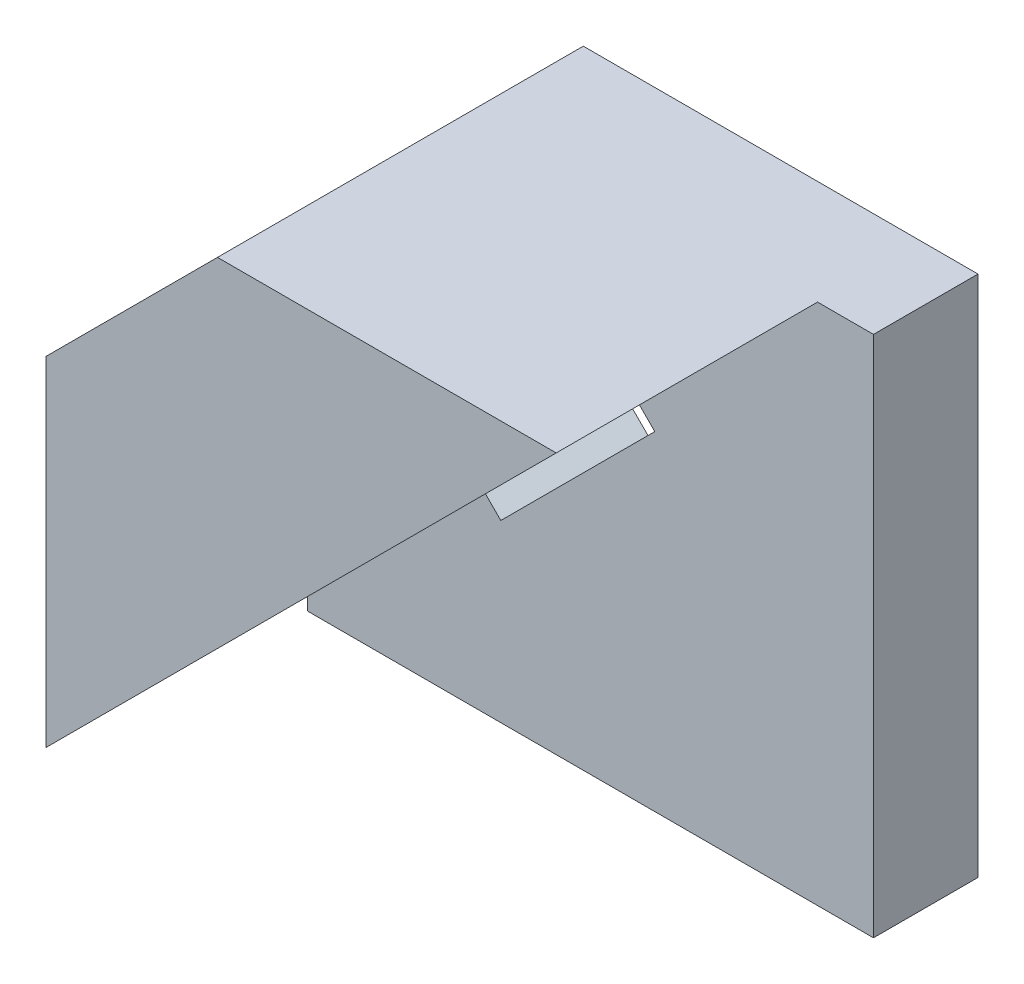
ISO-10303-21;
HEADER;
FILE_DESCRIPTION(('STEP AP214'),'2;1');
FILE_NAME('part.step','',(''),(''),'','','');
FILE_SCHEMA(('AUTOMOTIVE_DESIGN { 1 0 10303 214 1 1 1 1 }'));
ENDSEC;
DATA;
#1=APPLICATION_CONTEXT('core data for automotive mechanical design processes');
#2=APPLICATION_PROTOCOL_DEFINITION('international standard','automotive_design',2000,#1);
#3=PRODUCT_CONTEXT('',#1,'mechanical');
#4=PRODUCT('Part','Part','',(#3));
#5=PRODUCT_RELATED_PRODUCT_CATEGORY('part','',(#4));
#6=PRODUCT_DEFINITION_FORMATION('','',#4);
#7=PRODUCT_DEFINITION_CONTEXT('part definition',#1,'design');
#8=PRODUCT_DEFINITION('design','',#6,#7);
#9=PRODUCT_DEFINITION_SHAPE('','',#8);
#10=(LENGTH_UNIT() NAMED_UNIT(*) SI_UNIT(.MILLI.,.METRE.));
#11=(NAMED_UNIT(*) PLANE_ANGLE_UNIT() SI_UNIT($,.RADIAN.));
#12=(NAMED_UNIT(*) SI_UNIT($,.STERADIAN.) SOLID_ANGLE_UNIT());
#13=UNCERTAINTY_MEASURE_WITH_UNIT(LENGTH_MEASURE(1.E-05),#10,'distance_accuracy_value','');
#14=(GEOMETRIC_REPRESENTATION_CONTEXT(3) GLOBAL_UNCERTAINTY_ASSIGNED_CONTEXT((#13)) GLOBAL_UNIT_ASSIGNED_CONTEXT((#10,
#11,#12)) REPRESENTATION_CONTEXT('',''));
#15=CARTESIAN_POINT('',(0.,0.,0.));
#16=DIRECTION('',(0.,0.,1.));
#17=DIRECTION('',(1.,0.,0.));
#18=AXIS2_PLACEMENT_3D('',#15,#16,#17);
#19=CARTESIAN_POINT('',(0.,0.,0.));
#20=DIRECTION('',(0.,0.,1.));
#21=DIRECTION('',(1.,0.,0.));
#22=AXIS2_PLACEMENT_3D('',#19,#20,#21);
#23=PLANE('',#22);
#24=DIRECTION('',(-1.,0.,0.));
#25=VECTOR('',#24,1.);
#26=CARTESIAN_POINT('',(0.,7.61999999999999,0.));
#27=LINE('',#26,#25);
#28=CARTESIAN_POINT('',(-68.58,7.61999999999999,0.));
#29=VERTEX_POINT('',#28);
#30=CARTESIAN_POINT('',(-101.6,7.61999999999999,0.));
#31=VERTEX_POINT('',#30);
#32=EDGE_CURVE('E164',#29,#31,#27,.T.);
#33=ORIENTED_EDGE('',*,*,#32,.F.);
#34=DIRECTION('',(0.,-1.,0.));
#35=VECTOR('',#34,1.);
#36=CARTESIAN_POINT('',(-68.58,0.,0.));
#37=LINE('',#36,#35);
#38=CARTESIAN_POINT('',(-68.58,38.1,0.));
#39=VERTEX_POINT('',#38);
#40=EDGE_CURVE('E170',#39,#29,#37,.T.);
#41=ORIENTED_EDGE('',*,*,#40,.F.);
#42=DIRECTION('',(1.,0.,0.));
#43=VECTOR('',#42,1.);
#44=CARTESIAN_POINT('',(91.6,38.1,0.));
#45=LINE('',#44,#43);
#46=CARTESIAN_POINT('',(-71.8434365336479,38.1,0.));
#47=VERTEX_POINT('',#46);
#48=EDGE_CURVE('E273',#47,#39,#45,.T.);
#49=ORIENTED_EDGE('',*,*,#48,.F.);
#50=DIRECTION('',(0.707106781186546,0.707106781186549,0.));
#51=VECTOR('',#50,1.);
#52=CARTESIAN_POINT('',(-71.8434365336479,38.1,0.));
#53=LINE('',#52,#51);
#54=CARTESIAN_POINT('',(-82.2315902062893,27.7118463273585,0.));
#55=VERTEX_POINT('',#54);
#56=EDGE_CURVE('E207',#55,#47,#53,.T.);
#57=ORIENTED_EDGE('',*,*,#56,.F.);
#58=DIRECTION('',(-0.707106781186548,0.707106781186547,0.));
#59=VECTOR('',#58,1.);
#60=CARTESIAN_POINT('',(-81.3335645941824,26.8138207152516,0.));
#61=LINE('',#60,#59);
#62=CARTESIAN_POINT('',(-81.3335645941824,26.8138207152516,0.));
#63=VERTEX_POINT('',#62);
#64=EDGE_CURVE('E262',#63,#55,#61,.T.);
#65=ORIENTED_EDGE('',*,*,#64,.F.);
#66=DIRECTION('',(0.707106781186547,0.707106781186548,0.));
#67=VECTOR('',#66,1.);
#68=CARTESIAN_POINT('',(-81.3335645941824,26.8138207152516,0.));
#69=LINE('',#68,#67);
#70=CARTESIAN_POINT('',(-90.3138207152516,17.8335645941825,0.));
#71=VERTEX_POINT('',#70);
#72=EDGE_CURVE('E252',#71,#63,#69,.T.);
#73=ORIENTED_EDGE('',*,*,#72,.F.);
#74=DIRECTION('',(-0.707106781186548,0.707106781186547,0.));
#75=VECTOR('',#74,1.);
#76=CARTESIAN_POINT('',(-90.3138207152516,17.8335645941824,0.));
#77=LINE('',#76,#75);
#78=CARTESIAN_POINT('',(-91.2118463273585,18.7315902062893,0.));
#79=VERTEX_POINT('',#78);
#80=EDGE_CURVE('E265',#71,#79,#77,.T.);
#81=ORIENTED_EDGE('',*,*,#80,.T.);
#82=DIRECTION('',(0.707106781186546,0.707106781186549,0.));
#83=VECTOR('',#82,1.);
#84=CARTESIAN_POINT('',(-90.762833521305,19.1806030123429,0.));
#85=LINE('',#84,#83);
#86=CARTESIAN_POINT('',(-101.6,8.34343653364779,0.));
#87=VERTEX_POINT('',#86);
#88=EDGE_CURVE('E228',#87,#79,#85,.T.);
#89=ORIENTED_EDGE('',*,*,#88,.F.);
#90=DIRECTION('',(0.,1.,0.));
#91=VECTOR('',#90,1.);
#92=CARTESIAN_POINT('',(-101.6,-28.1,0.));
#93=LINE('',#92,#91);
#94=EDGE_CURVE('E173',#31,#87,#93,.T.);
#95=ORIENTED_EDGE('',*,*,#94,.F.);
#96=EDGE_LOOP('',(#33,#41,#49,#57,#65,#73,#81,#89,#95));
#97=FACE_BOUND('',#96,.T.);
#98=ADVANCED_FACE('F41',(#97),#23,.T.);
#99=CARTESIAN_POINT('',(0.,0.,-6.096));
#100=DIRECTION('',(0.,0.,1.));
#101=DIRECTION('',(1.,0.,0.));
#102=AXIS2_PLACEMENT_3D('',#99,#100,#101);
#103=PLANE('',#102);
#104=DIRECTION('',(0.,-1.,0.));
#105=VECTOR('',#104,1.);
#106=CARTESIAN_POINT('',(-68.58,0.,-6.096));
#107=LINE('',#106,#105);
#108=CARTESIAN_POINT('',(-68.58,38.1,-6.096));
#109=VERTEX_POINT('',#108);
#110=CARTESIAN_POINT('',(-68.58,7.61999999999999,-6.096));
#111=VERTEX_POINT('',#110);
#112=EDGE_CURVE('E62',#109,#111,#107,.T.);
#113=ORIENTED_EDGE('',*,*,#112,.T.);
#114=DIRECTION('',(-1.,0.,0.));
#115=VECTOR('',#114,1.);
#116=CARTESIAN_POINT('',(0.,7.61999999999999,-6.096));
#117=LINE('',#116,#115);
#118=CARTESIAN_POINT('',(-101.6,7.61999999999999,-6.096));
#119=VERTEX_POINT('',#118);
#120=EDGE_CURVE('E56',#111,#119,#117,.T.);
#121=ORIENTED_EDGE('',*,*,#120,.T.);
#122=DIRECTION('',(0.,1.,0.));
#123=VECTOR('',#122,1.);
#124=CARTESIAN_POINT('',(-101.6,-28.1,-6.096));
#125=LINE('',#124,#123);
#126=CARTESIAN_POINT('',(-101.6,28.1,-6.096));
#127=VERTEX_POINT('',#126);
#128=EDGE_CURVE('E270',#119,#127,#125,.T.);
#129=ORIENTED_EDGE('',*,*,#128,.T.);
#130=DIRECTION('',(0.707106781186547,0.707106781186548,0.));
#131=VECTOR('',#130,1.);
#132=CARTESIAN_POINT('',(-91.6,38.1,-6.096));
#133=LINE('',#132,#131);
#134=CARTESIAN_POINT('',(-98.9125316792003,30.7874683207997,-6.096));
#135=VERTEX_POINT('',#134);
#136=EDGE_CURVE('E274',#127,#135,#133,.T.);
#137=ORIENTED_EDGE('',*,*,#136,.T.);
#138=DIRECTION('',(-0.997432533711125,-0.0716124339385674,0.));
#139=VECTOR('',#138,1.);
#140=CARTESIAN_POINT('',(-100.985720539792,30.6386200575804,-6.096));
#141=LINE('',#140,#139);
#142=CARTESIAN_POINT('',(-98.3320387982348,30.8291458345011,-6.096));
#143=VERTEX_POINT('',#142);
#144=EDGE_CURVE('E292',#135,#143,#141,.F.);
#145=ORIENTED_EDGE('',*,*,#144,.T.);
#146=DIRECTION('',(-0.707106781186548,0.707106781186547,0.));
#147=VECTOR('',#146,1.);
#148=CARTESIAN_POINT('',(-87.8251391365839,20.3222461728501,-6.096));
#149=LINE('',#148,#147);
#150=CARTESIAN_POINT('',(-87.8251391365839,20.3222461728501,-6.096));
#151=VERTEX_POINT('',#150);
#152=EDGE_CURVE('E258',#151,#143,#149,.T.);
#153=ORIENTED_EDGE('',*,*,#152,.F.);
#154=DIRECTION('',(-0.707106781186546,-0.707106781186549,0.));
#155=VECTOR('',#154,1.);
#156=CARTESIAN_POINT('',(-87.8251391365839,20.3222461728501,-6.096));
#157=LINE('',#156,#155);
#158=CARTESIAN_POINT('',(-83.8222461728501,24.3251391365839,-6.096));
#159=VERTEX_POINT('',#158);
#160=EDGE_CURVE('E247',#159,#151,#157,.T.);
#161=ORIENTED_EDGE('',*,*,#160,.F.);
#162=DIRECTION('',(-0.707106781186548,0.707106781186547,0.));
#163=VECTOR('',#162,1.);
#164=CARTESIAN_POINT('',(-83.8222461728501,24.3251391365839,-6.096));
#165=LINE('',#164,#163);
#166=CARTESIAN_POINT('',(-94.329145834501,34.8320387982348,-6.096));
#167=VERTEX_POINT('',#166);
#168=EDGE_CURVE('E259',#159,#167,#165,.T.);
#169=ORIENTED_EDGE('',*,*,#168,.T.);
#170=DIRECTION('',(-0.0716124339386079,-0.997432533711122,0.));
#171=VECTOR('',#170,1.);
#172=CARTESIAN_POINT('',(-94.329145834501,34.8320387982348,-6.096));
#173=LINE('',#172,#171);
#174=CARTESIAN_POINT('',(-94.2874683207996,35.4125316792003,-6.096));
#175=VERTEX_POINT('',#174);
#176=EDGE_CURVE('E294',#167,#175,#173,.F.);
#177=ORIENTED_EDGE('',*,*,#176,.T.);
#178=CARTESIAN_POINT('',(-91.6,38.1,-6.096));
#179=VERTEX_POINT('',#178);
#180=EDGE_CURVE('E272',#175,#179,#133,.T.);
#181=ORIENTED_EDGE('',*,*,#180,.T.);
#182=DIRECTION('',(1.,0.,0.));
#183=VECTOR('',#182,1.);
#184=CARTESIAN_POINT('',(91.6,38.1,-6.096));
#185=LINE('',#184,#183);
#186=EDGE_CURVE('E277',#179,#109,#185,.T.);
#187=ORIENTED_EDGE('',*,*,#186,.T.);
#188=EDGE_LOOP('',(#113,#121,#129,#137,#145,#153,#161,#169,#177,#181,#187));
#189=FACE_BOUND('',#188,.T.);
#190=ADVANCED_FACE('F309',(#189),#103,.F.);
#191=CARTESIAN_POINT('',(-101.6,-28.1,-6.096));
#192=DIRECTION('',(1.,0.,0.));
#193=DIRECTION('',(0.,0.,-1.));
#194=AXIS2_PLACEMENT_3D('',#191,#192,#193);
#195=PLANE('',#194);
#196=ORIENTED_EDGE('',*,*,#128,.F.);
#197=DIRECTION('',(0.,0.,1.));
#198=VECTOR('',#197,1.);
#199=CARTESIAN_POINT('',(-101.6,7.61999999999999,-6.096));
#200=LINE('',#199,#198);
#201=EDGE_CURVE('E174',#119,#31,#200,.T.);
#202=ORIENTED_EDGE('',*,*,#201,.T.);
#203=ORIENTED_EDGE('',*,*,#94,.T.);
#204=DIRECTION('',(0.,0.,-1.));
#205=VECTOR('',#204,1.);
#206=CARTESIAN_POINT('',(-101.6,8.34343653364779,10.16));
#207=LINE('',#206,#205);
#208=CARTESIAN_POINT('',(-101.6,8.34343653364779,15.24));
#209=VERTEX_POINT('',#208);
#210=EDGE_CURVE('E239',#209,#87,#207,.T.);
#211=ORIENTED_EDGE('',*,*,#210,.F.);
#212=DIRECTION('',(0.,-1.,0.));
#213=VECTOR('',#212,1.);
#214=CARTESIAN_POINT('',(-101.6,28.1,15.24));
#215=LINE('',#214,#213);
#216=CARTESIAN_POINT('',(-101.6,28.1,15.24));
#217=VERTEX_POINT('',#216);
#218=EDGE_CURVE('E185',#217,#209,#215,.T.);
#219=ORIENTED_EDGE('',*,*,#218,.F.);
#220=DIRECTION('',(0.,0.,1.));
#221=VECTOR('',#220,1.);
#222=CARTESIAN_POINT('',(-101.6,28.1,-6.096));
#223=LINE('',#222,#221);
#224=EDGE_CURVE('E284',#127,#217,#223,.T.);
#225=ORIENTED_EDGE('',*,*,#224,.F.);
#226=EDGE_LOOP('',(#196,#202,#203,#211,#219,#225));
#227=FACE_BOUND('',#226,.T.);
#228=ADVANCED_FACE('F377',(#227),#195,.F.);
#229=CARTESIAN_POINT('',(-91.6,38.1,-6.096));
#230=DIRECTION('',(0.707106781186548,-0.707106781186547,0.));
#231=DIRECTION('',(0.707106781186547,0.707106781186548,0.));
#232=AXIS2_PLACEMENT_3D('',#229,#230,#231);
#233=PLANE('',#232);
#234=ORIENTED_EDGE('',*,*,#224,.T.);
#235=DIRECTION('',(-0.707106781186547,-0.707106781186548,0.));
#236=VECTOR('',#235,1.);
#237=CARTESIAN_POINT('',(-91.6,38.1,15.24));
#238=LINE('',#237,#236);
#239=CARTESIAN_POINT('',(-91.6,38.1,15.24));
#240=VERTEX_POINT('',#239);
#241=EDGE_CURVE('E194',#240,#217,#238,.T.);
#242=ORIENTED_EDGE('',*,*,#241,.F.);
#243=DIRECTION('',(0.,0.,1.));
#244=VECTOR('',#243,1.);
#245=CARTESIAN_POINT('',(-91.6,38.1,-6.096));
#246=LINE('',#245,#244);
#247=EDGE_CURVE('E280',#179,#240,#246,.T.);
#248=ORIENTED_EDGE('',*,*,#247,.F.);
#249=ORIENTED_EDGE('',*,*,#180,.F.);
#250=DIRECTION('',(0.353553390593272,0.353553390593272,0.86602540378444));
#251=VECTOR('',#250,1.);
#252=CARTESIAN_POINT('',(-93.6156012405997,36.0843987594003,-4.45026847853664));
#253=LINE('',#252,#251);
#254=CARTESIAN_POINT('',(-91.798786742132,37.901213257868,0.));
#255=VERTEX_POINT('',#254);
#256=EDGE_CURVE('E299',#175,#255,#253,.T.);
#257=ORIENTED_EDGE('',*,*,#256,.T.);
#258=DIRECTION('',(-0.707106781186532,-0.707106781186563,0.));
#259=VECTOR('',#258,1.);
#260=CARTESIAN_POINT('',(-92.5588847455188,37.1411152544812,0.));
#261=LINE('',#260,#259);
#262=CARTESIAN_POINT('',(-92.5588847455188,37.1411152544812,0.));
#263=VERTEX_POINT('',#262);
#264=EDGE_CURVE('E204',#255,#263,#261,.T.);
#265=ORIENTED_EDGE('',*,*,#264,.T.);
#266=DIRECTION('',(0.,0.,-1.));
#267=VECTOR('',#266,1.);
#268=CARTESIAN_POINT('',(-92.5588847455188,37.1411152544812,10.16));
#269=LINE('',#268,#267);
#270=CARTESIAN_POINT('',(-92.5588847455188,37.1411152544812,10.16));
#271=VERTEX_POINT('',#270);
#272=EDGE_CURVE('E203',#271,#263,#269,.T.);
#273=ORIENTED_EDGE('',*,*,#272,.F.);
#274=DIRECTION('',(-0.707106781186547,-0.707106781186548,0.));
#275=VECTOR('',#274,1.);
#276=CARTESIAN_POINT('',(-91.6,38.1,10.16));
#277=LINE('',#276,#275);
#278=CARTESIAN_POINT('',(-100.641115254481,29.0588847455189,10.16));
#279=VERTEX_POINT('',#278);
#280=EDGE_CURVE('E180',#271,#279,#277,.T.);
#281=ORIENTED_EDGE('',*,*,#280,.T.);
#282=DIRECTION('',(0.,0.,-1.));
#283=VECTOR('',#282,1.);
#284=CARTESIAN_POINT('',(-100.641115254481,29.0588847455189,10.16));
#285=LINE('',#284,#283);
#286=CARTESIAN_POINT('',(-100.641115254481,29.0588847455189,0.));
#287=VERTEX_POINT('',#286);
#288=EDGE_CURVE('E242',#279,#287,#285,.T.);
#289=ORIENTED_EDGE('',*,*,#288,.T.);
#290=DIRECTION('',(-0.707106781186569,-0.707106781186526,0.));
#291=VECTOR('',#290,1.);
#292=CARTESIAN_POINT('',(-101.6,28.1,0.));
#293=LINE('',#292,#291);
#294=CARTESIAN_POINT('',(-101.401213257868,28.298786742132,0.));
#295=VERTEX_POINT('',#294);
#296=EDGE_CURVE('E231',#287,#295,#293,.T.);
#297=ORIENTED_EDGE('',*,*,#296,.T.);
#298=DIRECTION('',(0.353553390593272,0.353553390593272,-0.86602540378444));
#299=VECTOR('',#298,1.);
#300=CARTESIAN_POINT('',(-97.0843987594003,32.6156012405997,-10.5739928354945));
#301=LINE('',#300,#299);
#302=EDGE_CURVE('E304',#295,#135,#301,.T.);
#303=ORIENTED_EDGE('',*,*,#302,.T.);
#304=ORIENTED_EDGE('',*,*,#136,.F.);
#305=EDGE_LOOP('',(#234,#242,#248,#249,#257,#265,#273,#281,#289,#297,#303,#304));
#306=FACE_BOUND('',#305,.T.);
#307=ADVANCED_FACE('F315',(#306),#233,.F.);
#308=CARTESIAN_POINT('',(91.6,38.1,-6.096));
#309=DIRECTION('',(0.,-1.,0.));
#310=DIRECTION('',(0.,0.,-1.));
#311=AXIS2_PLACEMENT_3D('',#308,#309,#310);
#312=PLANE('',#311);
#313=ORIENTED_EDGE('',*,*,#48,.T.);
#314=DIRECTION('',(0.,0.,-1.));
#315=VECTOR('',#314,1.);
#316=CARTESIAN_POINT('',(-68.58,38.1,-6.096));
#317=LINE('',#316,#315);
#318=EDGE_CURVE('E49',#39,#109,#317,.T.);
#319=ORIENTED_EDGE('',*,*,#318,.T.);
#320=ORIENTED_EDGE('',*,*,#186,.F.);
#321=ORIENTED_EDGE('',*,*,#247,.T.);
#322=DIRECTION('',(-1.,0.,0.));
#323=VECTOR('',#322,1.);
#324=CARTESIAN_POINT('',(-71.8434365336479,38.1,15.24));
#325=LINE('',#324,#323);
#326=CARTESIAN_POINT('',(-71.8434365336479,38.1,15.24));
#327=VERTEX_POINT('',#326);
#328=EDGE_CURVE('E191',#327,#240,#325,.T.);
#329=ORIENTED_EDGE('',*,*,#328,.F.);
#330=DIRECTION('',(0.,0.,-1.));
#331=VECTOR('',#330,1.);
#332=CARTESIAN_POINT('',(-71.8434365336479,38.1,10.16));
#333=LINE('',#332,#331);
#334=EDGE_CURVE('E214',#327,#47,#333,.T.);
#335=ORIENTED_EDGE('',*,*,#334,.T.);
#336=EDGE_LOOP('',(#313,#319,#320,#321,#329,#335));
#337=FACE_BOUND('',#336,.T.);
#338=ADVANCED_FACE('F307',(#337),#312,.F.);
#339=CARTESIAN_POINT('',(-83.8222461728501,24.3251391365839,-6.096));
#340=DIRECTION('',(0.612372435695795,0.612372435695796,-0.499999999999998));
#341=DIRECTION('',(-0.707106781186548,0.707106781186547,0.));
#342=AXIS2_PLACEMENT_3D('',#339,#340,#341);
#343=PLANE('',#342);
#344=ORIENTED_EDGE('',*,*,#64,.T.);
#345=DIRECTION('',(-0.707106781186548,0.707106781186547,0.));
#346=VECTOR('',#345,1.);
#347=CARTESIAN_POINT('',(-81.3335645941824,26.8138207152516,0.));
#348=LINE('',#347,#346);
#349=CARTESIAN_POINT('',(-91.8404642558334,37.3207203769025,0.));
#350=VERTEX_POINT('',#349);
#351=EDGE_CURVE('E220',#55,#350,#348,.T.);
#352=ORIENTED_EDGE('',*,*,#351,.T.);
#353=DIRECTION('',(-0.353553390593272,-0.353553390593272,-0.86602540378444));
#354=VECTOR('',#353,1.);
#355=CARTESIAN_POINT('',(-94.329145834501,34.8320387982348,-6.096));
#356=LINE('',#355,#354);
#357=EDGE_CURVE('E296',#350,#167,#356,.T.);
#358=ORIENTED_EDGE('',*,*,#357,.T.);
#359=ORIENTED_EDGE('',*,*,#168,.F.);
#360=DIRECTION('',(-0.353553390593272,-0.353553390593273,-0.86602540378444));
#361=VECTOR('',#360,1.);
#362=CARTESIAN_POINT('',(-83.8222461728501,24.3251391365839,-6.096));
#363=LINE('',#362,#361);
#364=EDGE_CURVE('E255',#63,#159,#363,.T.);
#365=ORIENTED_EDGE('',*,*,#364,.F.);
#366=EDGE_LOOP('',(#344,#352,#358,#359,#365));
#367=FACE_BOUND('',#366,.T.);
#368=ADVANCED_FACE('F328',(#367),#343,.F.);
#369=CARTESIAN_POINT('',(-90.3138207152516,17.8335645941824,0.));
#370=DIRECTION('',(-0.612372435695795,-0.612372435695796,-0.499999999999998));
#371=DIRECTION('',(0.707106781186548,-0.707106781186547,0.));
#372=AXIS2_PLACEMENT_3D('',#369,#370,#371);
#373=PLANE('',#372);
#374=ORIENTED_EDGE('',*,*,#152,.T.);
#375=DIRECTION('',(-0.353553390593272,-0.353553390593272,0.86602540378444));
#376=VECTOR('',#375,1.);
#377=CARTESIAN_POINT('',(-100.820720376903,28.3404642558334,0.));
#378=LINE('',#377,#376);
#379=CARTESIAN_POINT('',(-100.820720376903,28.3404642558334,0.));
#380=VERTEX_POINT('',#379);
#381=EDGE_CURVE('E301',#143,#380,#378,.T.);
#382=ORIENTED_EDGE('',*,*,#381,.T.);
#383=DIRECTION('',(0.707106781186548,-0.707106781186547,0.));
#384=VECTOR('',#383,1.);
#385=CARTESIAN_POINT('',(-90.3138207152516,17.8335645941824,0.));
#386=LINE('',#385,#384);
#387=EDGE_CURVE('E245',#380,#79,#386,.T.);
#388=ORIENTED_EDGE('',*,*,#387,.T.);
#389=ORIENTED_EDGE('',*,*,#80,.F.);
#390=DIRECTION('',(-0.353553390593272,-0.353553390593273,0.86602540378444));
#391=VECTOR('',#390,1.);
#392=CARTESIAN_POINT('',(-90.3138207152516,17.8335645941824,0.));
#393=LINE('',#392,#391);
#394=EDGE_CURVE('E250',#151,#71,#393,.T.);
#395=ORIENTED_EDGE('',*,*,#394,.F.);
#396=EDGE_LOOP('',(#374,#382,#388,#389,#395));
#397=FACE_BOUND('',#396,.T.);
#398=ADVANCED_FACE('F361',(#397),#373,.F.);
#399=CARTESIAN_POINT('',(-54.0736926547172,54.073692654717,0.));
#400=DIRECTION('',(0.707106781186549,-0.707106781186546,0.));
#401=DIRECTION('',(0.707106781186546,0.707106781186549,0.));
#402=AXIS2_PLACEMENT_3D('',#399,#400,#401);
#403=PLANE('',#402);
#404=ORIENTED_EDGE('',*,*,#160,.T.);
#405=ORIENTED_EDGE('',*,*,#394,.T.);
#406=ORIENTED_EDGE('',*,*,#72,.T.);
#407=ORIENTED_EDGE('',*,*,#364,.T.);
#408=EDGE_LOOP('',(#404,#405,#406,#407));
#409=FACE_BOUND('',#408,.T.);
#410=ADVANCED_FACE('F339',(#409),#403,.F.);
#411=CARTESIAN_POINT('',(-94.329145834501,34.8320387982348,-6.096));
#412=DIRECTION('',(0.933012701892222,-0.0669872981078136,-0.353553390593259));
#413=DIRECTION('',(-0.353553390593272,-0.353553390593272,-0.86602540378444));
#414=AXIS2_PLACEMENT_3D('',#411,#412,#413);
#415=PLANE('',#414);
#416=DIRECTION('',(0.0716124339386079,0.997432533711122,0.));
#417=VECTOR('',#416,1.);
#418=CARTESIAN_POINT('',(-94.0352408067868,6.75142653019521,0.));
#419=LINE('',#418,#417);
#420=EDGE_CURVE('E289',#255,#350,#419,.F.);
#421=ORIENTED_EDGE('',*,*,#420,.F.);
#422=ORIENTED_EDGE('',*,*,#256,.F.);
#423=ORIENTED_EDGE('',*,*,#176,.F.);
#424=ORIENTED_EDGE('',*,*,#357,.F.);
#425=EDGE_LOOP('',(#421,#422,#423,#424));
#426=FACE_BOUND('',#425,.T.);
#427=ADVANCED_FACE('F335',(#426),#415,.F.);
#428=CARTESIAN_POINT('',(-100.820720376903,28.3404642558334,0.));
#429=DIRECTION('',(0.0669872981077754,-0.93301270189222,-0.353553390593274));
#430=DIRECTION('',(-0.353553390593272,-0.353553390593272,0.86602540378444));
#431=AXIS2_PLACEMENT_3D('',#428,#429,#430);
#432=PLANE('',#431);
#433=ORIENTED_EDGE('',*,*,#144,.F.);
#434=ORIENTED_EDGE('',*,*,#302,.F.);
#435=DIRECTION('',(0.997432533711125,0.0716124339385674,0.));
#436=VECTOR('',#435,1.);
#437=CARTESIAN_POINT('',(-2.54136187858484,35.3966047266072,0.));
#438=LINE('',#437,#436);
#439=EDGE_CURVE('E286',#380,#295,#438,.F.);
#440=ORIENTED_EDGE('',*,*,#439,.F.);
#441=ORIENTED_EDGE('',*,*,#381,.F.);
#442=EDGE_LOOP('',(#433,#434,#440,#441));
#443=FACE_BOUND('',#442,.T.);
#444=ADVANCED_FACE('F43',(#443),#432,.F.);
#445=CARTESIAN_POINT('',(0.,0.,0.));
#446=DIRECTION('',(0.,0.,-1.));
#447=DIRECTION('',(-1.,0.,0.));
#448=AXIS2_PLACEMENT_3D('',#445,#446,#447);
#449=PLANE('',#448);
#450=ORIENTED_EDGE('',*,*,#387,.F.);
#451=ORIENTED_EDGE('',*,*,#439,.T.);
#452=ORIENTED_EDGE('',*,*,#296,.F.);
#453=DIRECTION('',(-0.707106781186548,0.707106781186547,0.));
#454=VECTOR('',#453,1.);
#455=CARTESIAN_POINT('',(-100.641115254481,29.0588847455189,0.));
#456=LINE('',#455,#454);
#457=CARTESIAN_POINT('',(-90.762833521305,19.1806030123429,0.));
#458=VERTEX_POINT('',#457);
#459=EDGE_CURVE('E223',#458,#287,#456,.T.);
#460=ORIENTED_EDGE('',*,*,#459,.F.);
#461=EDGE_CURVE('E234',#79,#458,#85,.T.);
#462=ORIENTED_EDGE('',*,*,#461,.F.);
#463=EDGE_LOOP('',(#450,#451,#452,#460,#462));
#464=FACE_BOUND('',#463,.T.);
#465=ADVANCED_FACE('F346',(#464),#449,.T.);
#466=CARTESIAN_POINT('',(-100.641115254481,29.0588847455189,10.16));
#467=DIRECTION('',(-0.707106781186547,-0.707106781186548,0.));
#468=DIRECTION('',(0.707106781186548,-0.707106781186547,0.));
#469=AXIS2_PLACEMENT_3D('',#466,#467,#468);
#470=PLANE('',#469);
#471=ORIENTED_EDGE('',*,*,#459,.T.);
#472=ORIENTED_EDGE('',*,*,#288,.F.);
#473=DIRECTION('',(-0.707106781186548,0.707106781186547,0.));
#474=VECTOR('',#473,1.);
#475=CARTESIAN_POINT('',(-100.641115254481,29.0588847455189,10.16));
#476=LINE('',#475,#474);
#477=CARTESIAN_POINT('',(-90.762833521305,19.1806030123429,10.16));
#478=VERTEX_POINT('',#477);
#479=EDGE_CURVE('E224',#478,#279,#476,.T.);
#480=ORIENTED_EDGE('',*,*,#479,.F.);
#481=DIRECTION('',(0.,0.,-1.));
#482=VECTOR('',#481,1.);
#483=CARTESIAN_POINT('',(-90.762833521305,19.1806030123429,10.16));
#484=LINE('',#483,#482);
#485=EDGE_CURVE('E227',#478,#458,#484,.T.);
#486=ORIENTED_EDGE('',*,*,#485,.T.);
#487=EDGE_LOOP('',(#471,#472,#480,#486));
#488=FACE_BOUND('',#487,.T.);
#489=ADVANCED_FACE('F349',(#488),#470,.F.);
#490=CARTESIAN_POINT('',(-90.762833521305,19.1806030123429,10.16));
#491=DIRECTION('',(-0.707106781186549,0.707106781186546,0.));
#492=DIRECTION('',(-0.707106781186546,-0.707106781186549,0.));
#493=AXIS2_PLACEMENT_3D('',#490,#491,#492);
#494=PLANE('',#493);
#495=ORIENTED_EDGE('',*,*,#88,.T.);
#496=ORIENTED_EDGE('',*,*,#461,.T.);
#497=ORIENTED_EDGE('',*,*,#485,.F.);
#498=DIRECTION('',(0.707106781186546,0.707106781186549,0.));
#499=VECTOR('',#498,1.);
#500=CARTESIAN_POINT('',(-101.6,8.34343653364779,10.16));
#501=LINE('',#500,#499);
#502=CARTESIAN_POINT('',(-82.6806030123427,27.2628335213051,10.16));
#503=VERTEX_POINT('',#502);
#504=EDGE_CURVE('E177',#478,#503,#501,.T.);
#505=ORIENTED_EDGE('',*,*,#504,.T.);
#506=DIRECTION('',(0.,0.,-1.));
#507=VECTOR('',#506,1.);
#508=CARTESIAN_POINT('',(-82.6806030123427,27.2628335213051,10.16));
#509=LINE('',#508,#507);
#510=CARTESIAN_POINT('',(-82.6806030123427,27.2628335213051,0.));
#511=VERTEX_POINT('',#510);
#512=EDGE_CURVE('E217',#503,#511,#509,.T.);
#513=ORIENTED_EDGE('',*,*,#512,.T.);
#514=EDGE_CURVE('E208',#511,#55,#53,.T.);
#515=ORIENTED_EDGE('',*,*,#514,.T.);
#516=ORIENTED_EDGE('',*,*,#56,.T.);
#517=ORIENTED_EDGE('',*,*,#334,.F.);
#518=DIRECTION('',(0.707106781186546,0.707106781186549,0.));
#519=VECTOR('',#518,1.);
#520=CARTESIAN_POINT('',(-101.6,8.34343653364779,15.24));
#521=LINE('',#520,#519);
#522=EDGE_CURVE('E188',#209,#327,#521,.T.);
#523=ORIENTED_EDGE('',*,*,#522,.F.);
#524=ORIENTED_EDGE('',*,*,#210,.T.);
#525=EDGE_LOOP('',(#495,#496,#497,#505,#513,#515,#516,#517,#523,#524));
#526=FACE_BOUND('',#525,.T.);
#527=ADVANCED_FACE('F322',(#526),#494,.F.);
#528=CARTESIAN_POINT('',(0.,0.,0.));
#529=DIRECTION('',(0.,0.,-1.));
#530=DIRECTION('',(-1.,0.,0.));
#531=AXIS2_PLACEMENT_3D('',#528,#529,#530);
#532=PLANE('',#531);
#533=ORIENTED_EDGE('',*,*,#351,.F.);
#534=ORIENTED_EDGE('',*,*,#514,.F.);
#535=DIRECTION('',(0.707106781186549,-0.707106781186546,0.));
#536=VECTOR('',#535,1.);
#537=CARTESIAN_POINT('',(-82.6806030123427,27.2628335213051,0.));
#538=LINE('',#537,#536);
#539=EDGE_CURVE('E196',#263,#511,#538,.T.);
#540=ORIENTED_EDGE('',*,*,#539,.F.);
#541=ORIENTED_EDGE('',*,*,#264,.F.);
#542=ORIENTED_EDGE('',*,*,#420,.T.);
#543=EDGE_LOOP('',(#533,#534,#540,#541,#542));
#544=FACE_BOUND('',#543,.T.);
#545=ADVANCED_FACE('F330',(#544),#532,.T.);
#546=CARTESIAN_POINT('',(-82.6806030123427,27.2628335213051,10.16));
#547=DIRECTION('',(0.707106781186545,0.707106781186549,0.));
#548=DIRECTION('',(-0.70710678118655,0.707106781186546,0.));
#549=AXIS2_PLACEMENT_3D('',#546,#547,#548);
#550=PLANE('',#549);
#551=ORIENTED_EDGE('',*,*,#539,.T.);
#552=ORIENTED_EDGE('',*,*,#512,.F.);
#553=DIRECTION('',(0.707106781186549,-0.707106781186546,0.));
#554=VECTOR('',#553,1.);
#555=CARTESIAN_POINT('',(-82.6806030123427,27.2628335213051,10.16));
#556=LINE('',#555,#554);
#557=EDGE_CURVE('E200',#271,#503,#556,.T.);
#558=ORIENTED_EDGE('',*,*,#557,.F.);
#559=ORIENTED_EDGE('',*,*,#272,.T.);
#560=EDGE_LOOP('',(#551,#552,#558,#559));
#561=FACE_BOUND('',#560,.T.);
#562=ADVANCED_FACE('F356',(#561),#550,.F.);
#563=CARTESIAN_POINT('',(0.,0.,15.24));
#564=DIRECTION('',(0.,0.,-1.));
#565=DIRECTION('',(-1.,0.,0.));
#566=AXIS2_PLACEMENT_3D('',#563,#564,#565);
#567=PLANE('',#566);
#568=ORIENTED_EDGE('',*,*,#218,.T.);
#569=ORIENTED_EDGE('',*,*,#522,.T.);
#570=ORIENTED_EDGE('',*,*,#328,.T.);
#571=ORIENTED_EDGE('',*,*,#241,.T.);
#572=EDGE_LOOP('',(#568,#569,#570,#571));
#573=FACE_BOUND('',#572,.T.);
#574=ADVANCED_FACE('F318',(#573),#567,.F.);
#575=CARTESIAN_POINT('',(0.,0.,10.16));
#576=DIRECTION('',(0.,0.,-1.));
#577=DIRECTION('',(-1.,0.,0.));
#578=AXIS2_PLACEMENT_3D('',#575,#576,#577);
#579=PLANE('',#578);
#580=ORIENTED_EDGE('',*,*,#504,.F.);
#581=ORIENTED_EDGE('',*,*,#479,.T.);
#582=ORIENTED_EDGE('',*,*,#280,.F.);
#583=ORIENTED_EDGE('',*,*,#557,.T.);
#584=EDGE_LOOP('',(#580,#581,#582,#583));
#585=FACE_BOUND('',#584,.T.);
#586=ADVANCED_FACE('F353',(#585),#579,.T.);
#587=CARTESIAN_POINT('',(-68.58,0.,0.));
#588=DIRECTION('',(-1.,0.,0.));
#589=DIRECTION('',(0.,0.,1.));
#590=AXIS2_PLACEMENT_3D('',#587,#588,#589);
#591=PLANE('',#590);
#592=ORIENTED_EDGE('',*,*,#40,.T.);
#593=DIRECTION('',(0.,0.,-1.));
#594=VECTOR('',#593,1.);
#595=CARTESIAN_POINT('',(-68.58,7.61999999999999,0.));
#596=LINE('',#595,#594);
#597=EDGE_CURVE('E11',#29,#111,#596,.T.);
#598=ORIENTED_EDGE('',*,*,#597,.T.);
#599=ORIENTED_EDGE('',*,*,#112,.F.);
#600=ORIENTED_EDGE('',*,*,#318,.F.);
#601=EDGE_LOOP('',(#592,#598,#599,#600));
#602=FACE_BOUND('',#601,.T.);
#603=ADVANCED_FACE('F176',(#602),#591,.F.);
#604=CARTESIAN_POINT('',(0.,7.61999999999999,0.));
#605=DIRECTION('',(0.,1.,0.));
#606=DIRECTION('',(0.,0.,1.));
#607=AXIS2_PLACEMENT_3D('',#604,#605,#606);
#608=PLANE('',#607);
#609=ORIENTED_EDGE('',*,*,#120,.F.);
#610=ORIENTED_EDGE('',*,*,#597,.F.);
#611=ORIENTED_EDGE('',*,*,#32,.T.);
#612=ORIENTED_EDGE('',*,*,#201,.F.);
#613=EDGE_LOOP('',(#609,#610,#611,#612));
#614=FACE_BOUND('',#613,.T.);
#615=ADVANCED_FACE('F163',(#614),#608,.F.);
#616=CLOSED_SHELL('',(#98,#190,#228,#307,#338,#368,#398,#410,#427,#444,#465,#489,#527,#545,#562,
#574,#586,#603,#615));
#617=MANIFOLD_SOLID_BREP('B2',#616);
#618=ADVANCED_BREP_SHAPE_REPRESENTATION('',(#18,#617),#14);
#619=SHAPE_DEFINITION_REPRESENTATION(#9,#618);
ENDSEC;
END-ISO-10303-21;
